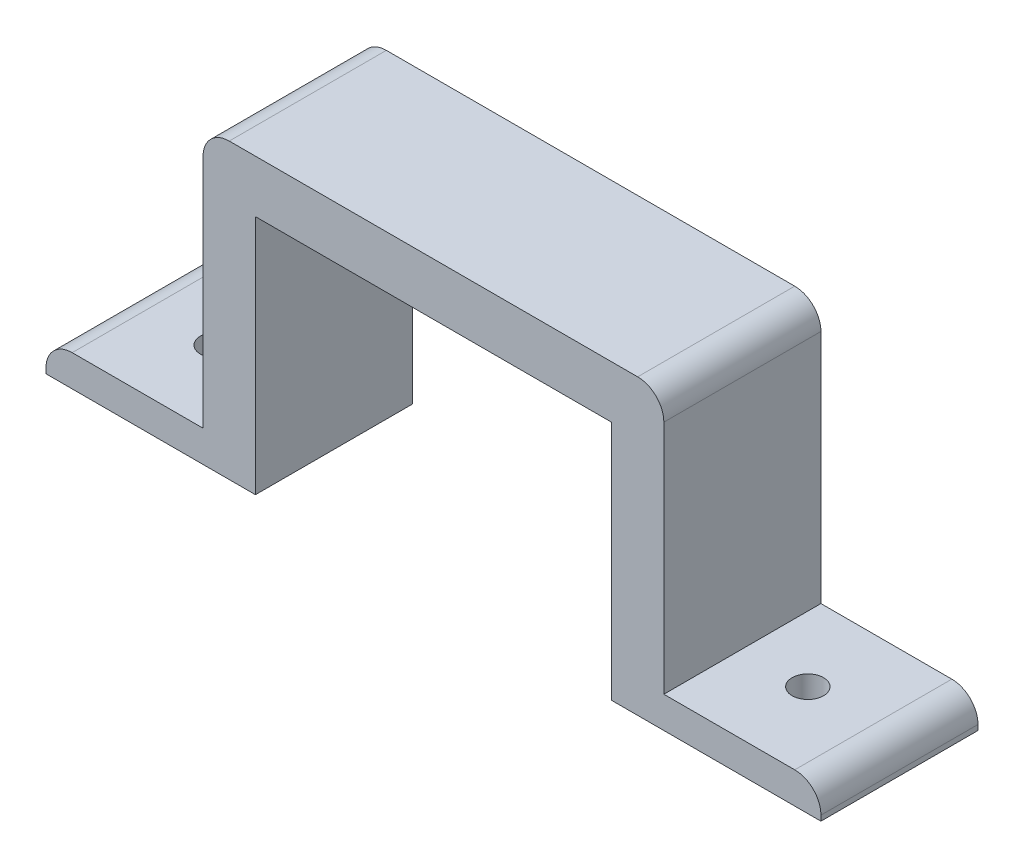
ISO-10303-21;
HEADER;
FILE_DESCRIPTION(('STEP AP214'),'2;1');
FILE_NAME('part.step','',(''),(''),'','','');
FILE_SCHEMA(('AUTOMOTIVE_DESIGN { 1 0 10303 214 1 1 1 1 }'));
ENDSEC;
DATA;
#1=APPLICATION_CONTEXT('core data for automotive mechanical design processes');
#2=APPLICATION_PROTOCOL_DEFINITION('international standard','automotive_design',2000,#1);
#3=PRODUCT_CONTEXT('',#1,'mechanical');
#4=PRODUCT('Part','Part','',(#3));
#5=PRODUCT_RELATED_PRODUCT_CATEGORY('part','',(#4));
#6=PRODUCT_DEFINITION_FORMATION('','',#4);
#7=PRODUCT_DEFINITION_CONTEXT('part definition',#1,'design');
#8=PRODUCT_DEFINITION('design','',#6,#7);
#9=PRODUCT_DEFINITION_SHAPE('','',#8);
#10=(LENGTH_UNIT() NAMED_UNIT(*) SI_UNIT(.MILLI.,.METRE.));
#11=(NAMED_UNIT(*) PLANE_ANGLE_UNIT() SI_UNIT($,.RADIAN.));
#12=(NAMED_UNIT(*) SI_UNIT($,.STERADIAN.) SOLID_ANGLE_UNIT());
#13=UNCERTAINTY_MEASURE_WITH_UNIT(LENGTH_MEASURE(1.E-05),#10,'distance_accuracy_value','');
#14=(GEOMETRIC_REPRESENTATION_CONTEXT(3) GLOBAL_UNCERTAINTY_ASSIGNED_CONTEXT((#13)) GLOBAL_UNIT_ASSIGNED_CONTEXT((#10,
#11,#12)) REPRESENTATION_CONTEXT('',''));
#15=CARTESIAN_POINT('',(0.,0.,0.));
#16=DIRECTION('',(0.,0.,1.));
#17=DIRECTION('',(1.,0.,0.));
#18=AXIS2_PLACEMENT_3D('',#15,#16,#17);
#19=CARTESIAN_POINT('',(-17.,0.,15.));
#20=DIRECTION('',(0.,1.,0.));
#21=DIRECTION('',(-1.,0.,0.));
#22=AXIS2_PLACEMENT_3D('',#19,#20,#21);
#23=PLANE('',#22);
#24=CARTESIAN_POINT('',(-28.25,0.,7.5));
#25=DIRECTION('',(0.,1.,0.));
#26=DIRECTION('',(-1.,0.,0.));
#27=AXIS2_PLACEMENT_3D('',#24,#25,#26);
#28=CIRCLE('',#27,1.5);
#29=CARTESIAN_POINT('',(-28.25,0.,9.));
#30=VERTEX_POINT('',#29);
#31=EDGE_CURVE('E270',#30,#30,#28,.F.);
#32=ORIENTED_EDGE('',*,*,#31,.F.);
#33=EDGE_LOOP('',(#32));
#34=FACE_BOUND('',#33,.T.);
#35=DIRECTION('',(1.,0.,0.));
#36=VECTOR('',#35,1.);
#37=CARTESIAN_POINT('',(-17.,0.,0.));
#38=LINE('',#37,#36);
#39=CARTESIAN_POINT('',(-37.,0.,0.));
#40=VERTEX_POINT('',#39);
#41=CARTESIAN_POINT('',(-17.,0.,0.));
#42=VERTEX_POINT('',#41);
#43=EDGE_CURVE('E170',#40,#42,#38,.T.);
#44=ORIENTED_EDGE('',*,*,#43,.T.);
#45=DIRECTION('',(0.,0.,-1.));
#46=VECTOR('',#45,1.);
#47=CARTESIAN_POINT('',(-17.,0.,15.));
#48=LINE('',#47,#46);
#49=CARTESIAN_POINT('',(-17.,0.,15.));
#50=VERTEX_POINT('',#49);
#51=EDGE_CURVE('E151',#50,#42,#48,.T.);
#52=ORIENTED_EDGE('',*,*,#51,.F.);
#53=DIRECTION('',(1.,0.,0.));
#54=VECTOR('',#53,1.);
#55=CARTESIAN_POINT('',(-17.,0.,15.));
#56=LINE('',#55,#54);
#57=CARTESIAN_POINT('',(-37.,0.,15.));
#58=VERTEX_POINT('',#57);
#59=EDGE_CURVE('E157',#58,#50,#56,.T.);
#60=ORIENTED_EDGE('',*,*,#59,.F.);
#61=DIRECTION('',(0.,0.,-1.));
#62=VECTOR('',#61,1.);
#63=CARTESIAN_POINT('',(-37.,0.,15.));
#64=LINE('',#63,#62);
#65=EDGE_CURVE('E239',#58,#40,#64,.T.);
#66=ORIENTED_EDGE('',*,*,#65,.T.);
#67=EDGE_LOOP('',(#44,#52,#60,#66));
#68=FACE_BOUND('',#67,.T.);
#69=ADVANCED_FACE('F33',(#34,#68),#23,.F.);
#70=CARTESIAN_POINT('',(-17.,23.,15.));
#71=DIRECTION('',(-1.,0.,0.));
#72=DIRECTION('',(0.,-1.,0.));
#73=AXIS2_PLACEMENT_3D('',#70,#71,#72);
#74=PLANE('',#73);
#75=DIRECTION('',(0.,1.,0.));
#76=VECTOR('',#75,1.);
#77=CARTESIAN_POINT('',(-17.,23.,0.));
#78=LINE('',#77,#76);
#79=CARTESIAN_POINT('',(-17.,23.,0.));
#80=VERTEX_POINT('',#79);
#81=EDGE_CURVE('E265',#42,#80,#78,.T.);
#82=ORIENTED_EDGE('',*,*,#81,.T.);
#83=DIRECTION('',(0.,0.,-1.));
#84=VECTOR('',#83,1.);
#85=CARTESIAN_POINT('',(-17.,23.,15.));
#86=LINE('',#85,#84);
#87=CARTESIAN_POINT('',(-17.,23.,15.));
#88=VERTEX_POINT('',#87);
#89=EDGE_CURVE('E154',#88,#80,#86,.T.);
#90=ORIENTED_EDGE('',*,*,#89,.F.);
#91=DIRECTION('',(0.,1.,0.));
#92=VECTOR('',#91,1.);
#93=CARTESIAN_POINT('',(-17.,23.,15.));
#94=LINE('',#93,#92);
#95=EDGE_CURVE('E147',#50,#88,#94,.T.);
#96=ORIENTED_EDGE('',*,*,#95,.F.);
#97=ORIENTED_EDGE('',*,*,#51,.T.);
#98=EDGE_LOOP('',(#82,#90,#96,#97));
#99=FACE_BOUND('',#98,.T.);
#100=ADVANCED_FACE('F149',(#99),#74,.F.);
#101=CARTESIAN_POINT('',(17.,23.,15.));
#102=DIRECTION('',(0.,1.,0.));
#103=DIRECTION('',(0.,0.,1.));
#104=AXIS2_PLACEMENT_3D('',#101,#102,#103);
#105=PLANE('',#104);
#106=DIRECTION('',(1.,0.,0.));
#107=VECTOR('',#106,1.);
#108=CARTESIAN_POINT('',(17.,23.,0.));
#109=LINE('',#108,#107);
#110=CARTESIAN_POINT('',(17.,23.,0.));
#111=VERTEX_POINT('',#110);
#112=EDGE_CURVE('E263',#80,#111,#109,.T.);
#113=ORIENTED_EDGE('',*,*,#112,.T.);
#114=DIRECTION('',(0.,0.,-1.));
#115=VECTOR('',#114,1.);
#116=CARTESIAN_POINT('',(17.,23.,15.));
#117=LINE('',#116,#115);
#118=CARTESIAN_POINT('',(17.,23.,15.));
#119=VERTEX_POINT('',#118);
#120=EDGE_CURVE('E176',#119,#111,#117,.T.);
#121=ORIENTED_EDGE('',*,*,#120,.F.);
#122=DIRECTION('',(1.,0.,0.));
#123=VECTOR('',#122,1.);
#124=CARTESIAN_POINT('',(17.,23.,15.));
#125=LINE('',#124,#123);
#126=EDGE_CURVE('E156',#88,#119,#125,.T.);
#127=ORIENTED_EDGE('',*,*,#126,.F.);
#128=ORIENTED_EDGE('',*,*,#89,.T.);
#129=EDGE_LOOP('',(#113,#121,#127,#128));
#130=FACE_BOUND('',#129,.T.);
#131=ADVANCED_FACE('F319',(#130),#105,.F.);
#132=CARTESIAN_POINT('',(17.,23.,15.));
#133=DIRECTION('',(1.,0.,0.));
#134=DIRECTION('',(0.,1.,0.));
#135=AXIS2_PLACEMENT_3D('',#132,#133,#134);
#136=PLANE('',#135);
#137=DIRECTION('',(0.,-1.,0.));
#138=VECTOR('',#137,1.);
#139=CARTESIAN_POINT('',(17.,23.,0.));
#140=LINE('',#139,#138);
#141=CARTESIAN_POINT('',(17.,0.,0.));
#142=VERTEX_POINT('',#141);
#143=EDGE_CURVE('E258',#111,#142,#140,.T.);
#144=ORIENTED_EDGE('',*,*,#143,.T.);
#145=DIRECTION('',(0.,0.,-1.));
#146=VECTOR('',#145,1.);
#147=CARTESIAN_POINT('',(17.,0.,15.));
#148=LINE('',#147,#146);
#149=CARTESIAN_POINT('',(17.,0.,15.));
#150=VERTEX_POINT('',#149);
#151=EDGE_CURVE('E249',#150,#142,#148,.T.);
#152=ORIENTED_EDGE('',*,*,#151,.F.);
#153=DIRECTION('',(0.,-1.,0.));
#154=VECTOR('',#153,1.);
#155=CARTESIAN_POINT('',(17.,23.,15.));
#156=LINE('',#155,#154);
#157=EDGE_CURVE('E259',#119,#150,#156,.T.);
#158=ORIENTED_EDGE('',*,*,#157,.F.);
#159=ORIENTED_EDGE('',*,*,#120,.T.);
#160=EDGE_LOOP('',(#144,#152,#158,#159));
#161=FACE_BOUND('',#160,.T.);
#162=ADVANCED_FACE('F256',(#161),#136,.F.);
#163=CARTESIAN_POINT('',(17.,0.,15.));
#164=DIRECTION('',(0.,1.,0.));
#165=DIRECTION('',(-1.,0.,0.));
#166=AXIS2_PLACEMENT_3D('',#163,#164,#165);
#167=PLANE('',#166);
#168=CARTESIAN_POINT('',(28.25,0.,7.49999999999999));
#169=DIRECTION('',(0.,1.,0.));
#170=DIRECTION('',(-1.,0.,0.));
#171=AXIS2_PLACEMENT_3D('',#168,#169,#170);
#172=CIRCLE('',#171,1.5);
#173=CARTESIAN_POINT('',(28.25,0.,8.99999999999999));
#174=VERTEX_POINT('',#173);
#175=EDGE_CURVE('E289',#174,#174,#172,.F.);
#176=ORIENTED_EDGE('',*,*,#175,.F.);
#177=EDGE_LOOP('',(#176));
#178=FACE_BOUND('',#177,.T.);
#179=DIRECTION('',(1.,0.,0.));
#180=VECTOR('',#179,1.);
#181=CARTESIAN_POINT('',(17.,0.,0.));
#182=LINE('',#181,#180);
#183=CARTESIAN_POINT('',(37.,0.,0.));
#184=VERTEX_POINT('',#183);
#185=EDGE_CURVE('E228',#142,#184,#182,.T.);
#186=ORIENTED_EDGE('',*,*,#185,.T.);
#187=DIRECTION('',(0.,0.,-1.));
#188=VECTOR('',#187,1.);
#189=CARTESIAN_POINT('',(37.,0.,15.));
#190=LINE('',#189,#188);
#191=CARTESIAN_POINT('',(37.,0.,15.));
#192=VERTEX_POINT('',#191);
#193=EDGE_CURVE('E246',#192,#184,#190,.T.);
#194=ORIENTED_EDGE('',*,*,#193,.F.);
#195=DIRECTION('',(1.,0.,0.));
#196=VECTOR('',#195,1.);
#197=CARTESIAN_POINT('',(17.,0.,15.));
#198=LINE('',#197,#196);
#199=EDGE_CURVE('E285',#150,#192,#198,.T.);
#200=ORIENTED_EDGE('',*,*,#199,.F.);
#201=ORIENTED_EDGE('',*,*,#151,.T.);
#202=EDGE_LOOP('',(#186,#194,#200,#201));
#203=FACE_BOUND('',#202,.T.);
#204=ADVANCED_FACE('F323',(#178,#203),#167,.F.);
#205=CARTESIAN_POINT('',(37.,0.,15.));
#206=DIRECTION('',(-1.,0.,0.));
#207=DIRECTION('',(0.,0.,1.));
#208=AXIS2_PLACEMENT_3D('',#205,#206,#207);
#209=PLANE('',#208);
#210=DIRECTION('',(0.,1.,0.));
#211=VECTOR('',#210,1.);
#212=CARTESIAN_POINT('',(37.,0.,0.));
#213=LINE('',#212,#211);
#214=CARTESIAN_POINT('',(37.,0.5,0.));
#215=VERTEX_POINT('',#214);
#216=EDGE_CURVE('E224',#184,#215,#213,.T.);
#217=ORIENTED_EDGE('',*,*,#216,.T.);
#218=DIRECTION('',(0.,0.,-1.));
#219=VECTOR('',#218,1.);
#220=CARTESIAN_POINT('',(37.,0.5,15.));
#221=LINE('',#220,#219);
#222=CARTESIAN_POINT('',(37.,0.5,15.));
#223=VERTEX_POINT('',#222);
#224=EDGE_CURVE('E11',#215,#223,#221,.F.);
#225=ORIENTED_EDGE('',*,*,#224,.T.);
#226=DIRECTION('',(0.,1.,0.));
#227=VECTOR('',#226,1.);
#228=CARTESIAN_POINT('',(37.,0.,15.));
#229=LINE('',#228,#227);
#230=EDGE_CURVE('E282',#192,#223,#229,.T.);
#231=ORIENTED_EDGE('',*,*,#230,.F.);
#232=ORIENTED_EDGE('',*,*,#193,.T.);
#233=EDGE_LOOP('',(#217,#225,#231,#232));
#234=FACE_BOUND('',#233,.T.);
#235=ADVANCED_FACE('F326',(#234),#209,.F.);
#236=CARTESIAN_POINT('',(37.,3.,15.));
#237=DIRECTION('',(0.,-1.,0.));
#238=DIRECTION('',(0.,0.,-1.));
#239=AXIS2_PLACEMENT_3D('',#236,#237,#238);
#240=PLANE('',#239);
#241=CARTESIAN_POINT('',(28.25,3.,7.49999999999999));
#242=DIRECTION('',(0.,1.,0.));
#243=DIRECTION('',(0.,0.,-1.));
#244=AXIS2_PLACEMENT_3D('',#241,#242,#243);
#245=CIRCLE('',#244,1.5);
#246=CARTESIAN_POINT('',(28.25,3.,8.99999999999999));
#247=VERTEX_POINT('',#246);
#248=EDGE_CURVE('E293',#247,#247,#245,.T.);
#249=ORIENTED_EDGE('',*,*,#248,.F.);
#250=EDGE_LOOP('',(#249));
#251=FACE_BOUND('',#250,.T.);
#252=DIRECTION('',(-1.,0.,0.));
#253=VECTOR('',#252,1.);
#254=CARTESIAN_POINT('',(37.,3.,15.));
#255=LINE('',#254,#253);
#256=CARTESIAN_POINT('',(34.5,3.,15.));
#257=VERTEX_POINT('',#256);
#258=CARTESIAN_POINT('',(22.,3.,15.));
#259=VERTEX_POINT('',#258);
#260=EDGE_CURVE('E213',#257,#259,#255,.T.);
#261=ORIENTED_EDGE('',*,*,#260,.F.);
#262=DIRECTION('',(0.,0.,-1.));
#263=VECTOR('',#262,1.);
#264=CARTESIAN_POINT('',(34.5,3.,15.));
#265=LINE('',#264,#263);
#266=CARTESIAN_POINT('',(34.5,3.,0.));
#267=VERTEX_POINT('',#266);
#268=EDGE_CURVE('E41',#257,#267,#265,.T.);
#269=ORIENTED_EDGE('',*,*,#268,.T.);
#270=DIRECTION('',(-1.,0.,0.));
#271=VECTOR('',#270,1.);
#272=CARTESIAN_POINT('',(37.,3.,0.));
#273=LINE('',#272,#271);
#274=CARTESIAN_POINT('',(22.,3.,0.));
#275=VERTEX_POINT('',#274);
#276=EDGE_CURVE('E211',#267,#275,#273,.T.);
#277=ORIENTED_EDGE('',*,*,#276,.T.);
#278=DIRECTION('',(0.,0.,-1.));
#279=VECTOR('',#278,1.);
#280=CARTESIAN_POINT('',(22.,3.,15.));
#281=LINE('',#280,#279);
#282=EDGE_CURVE('E244',#259,#275,#281,.T.);
#283=ORIENTED_EDGE('',*,*,#282,.F.);
#284=EDGE_LOOP('',(#261,#269,#277,#283));
#285=FACE_BOUND('',#284,.T.);
#286=ADVANCED_FACE('F209',(#251,#285),#240,.F.);
#287=CARTESIAN_POINT('',(22.,3.,15.));
#288=DIRECTION('',(-1.,0.,0.));
#289=DIRECTION('',(0.,0.,1.));
#290=AXIS2_PLACEMENT_3D('',#287,#288,#289);
#291=PLANE('',#290);
#292=DIRECTION('',(0.,1.,0.));
#293=VECTOR('',#292,1.);
#294=CARTESIAN_POINT('',(22.,3.,0.));
#295=LINE('',#294,#293);
#296=CARTESIAN_POINT('',(22.,25.5,0.));
#297=VERTEX_POINT('',#296);
#298=EDGE_CURVE('E223',#275,#297,#295,.T.);
#299=ORIENTED_EDGE('',*,*,#298,.T.);
#300=DIRECTION('',(0.,0.,-1.));
#301=VECTOR('',#300,1.);
#302=CARTESIAN_POINT('',(22.,25.5,15.));
#303=LINE('',#302,#301);
#304=CARTESIAN_POINT('',(22.,25.5,15.));
#305=VERTEX_POINT('',#304);
#306=EDGE_CURVE('E203',#297,#305,#303,.F.);
#307=ORIENTED_EDGE('',*,*,#306,.T.);
#308=DIRECTION('',(0.,1.,0.));
#309=VECTOR('',#308,1.);
#310=CARTESIAN_POINT('',(22.,3.,15.));
#311=LINE('',#310,#309);
#312=EDGE_CURVE('E278',#259,#305,#311,.T.);
#313=ORIENTED_EDGE('',*,*,#312,.F.);
#314=ORIENTED_EDGE('',*,*,#282,.T.);
#315=EDGE_LOOP('',(#299,#307,#313,#314));
#316=FACE_BOUND('',#315,.T.);
#317=ADVANCED_FACE('F363',(#316),#291,.F.);
#318=CARTESIAN_POINT('',(-22.,28.,15.));
#319=DIRECTION('',(0.,-1.,0.));
#320=DIRECTION('',(0.,0.,-1.));
#321=AXIS2_PLACEMENT_3D('',#318,#319,#320);
#322=PLANE('',#321);
#323=DIRECTION('',(-1.,0.,0.));
#324=VECTOR('',#323,1.);
#325=CARTESIAN_POINT('',(-22.,28.,0.));
#326=LINE('',#325,#324);
#327=CARTESIAN_POINT('',(19.5,28.,0.));
#328=VERTEX_POINT('',#327);
#329=CARTESIAN_POINT('',(-19.5,28.,0.));
#330=VERTEX_POINT('',#329);
#331=EDGE_CURVE('E226',#328,#330,#326,.T.);
#332=ORIENTED_EDGE('',*,*,#331,.T.);
#333=DIRECTION('',(0.,0.,-1.));
#334=VECTOR('',#333,1.);
#335=CARTESIAN_POINT('',(-19.5,28.,15.));
#336=LINE('',#335,#334);
#337=CARTESIAN_POINT('',(-19.5,28.,15.));
#338=VERTEX_POINT('',#337);
#339=EDGE_CURVE('E56',#330,#338,#336,.F.);
#340=ORIENTED_EDGE('',*,*,#339,.T.);
#341=DIRECTION('',(-1.,0.,0.));
#342=VECTOR('',#341,1.);
#343=CARTESIAN_POINT('',(-22.,28.,15.));
#344=LINE('',#343,#342);
#345=CARTESIAN_POINT('',(19.5,28.,15.));
#346=VERTEX_POINT('',#345);
#347=EDGE_CURVE('E276',#346,#338,#344,.T.);
#348=ORIENTED_EDGE('',*,*,#347,.F.);
#349=DIRECTION('',(0.,0.,-1.));
#350=VECTOR('',#349,1.);
#351=CARTESIAN_POINT('',(19.5,28.,15.));
#352=LINE('',#351,#350);
#353=EDGE_CURVE('E199',#346,#328,#352,.T.);
#354=ORIENTED_EDGE('',*,*,#353,.T.);
#355=EDGE_LOOP('',(#332,#340,#348,#354));
#356=FACE_BOUND('',#355,.T.);
#357=ADVANCED_FACE('F358',(#356),#322,.F.);
#358=CARTESIAN_POINT('',(-22.,3.,15.));
#359=DIRECTION('',(1.,0.,0.));
#360=DIRECTION('',(0.,0.,-1.));
#361=AXIS2_PLACEMENT_3D('',#358,#359,#360);
#362=PLANE('',#361);
#363=DIRECTION('',(0.,-1.,0.));
#364=VECTOR('',#363,1.);
#365=CARTESIAN_POINT('',(-22.,3.,15.));
#366=LINE('',#365,#364);
#367=CARTESIAN_POINT('',(-22.,25.5,15.));
#368=VERTEX_POINT('',#367);
#369=CARTESIAN_POINT('',(-22.,3.,15.));
#370=VERTEX_POINT('',#369);
#371=EDGE_CURVE('E274',#368,#370,#366,.T.);
#372=ORIENTED_EDGE('',*,*,#371,.F.);
#373=DIRECTION('',(0.,0.,-1.));
#374=VECTOR('',#373,1.);
#375=CARTESIAN_POINT('',(-22.,25.5,15.));
#376=LINE('',#375,#374);
#377=CARTESIAN_POINT('',(-22.,25.5,0.));
#378=VERTEX_POINT('',#377);
#379=EDGE_CURVE('E196',#368,#378,#376,.T.);
#380=ORIENTED_EDGE('',*,*,#379,.T.);
#381=DIRECTION('',(0.,-1.,0.));
#382=VECTOR('',#381,1.);
#383=CARTESIAN_POINT('',(-22.,3.,0.));
#384=LINE('',#383,#382);
#385=CARTESIAN_POINT('',(-22.,3.,0.));
#386=VERTEX_POINT('',#385);
#387=EDGE_CURVE('E233',#378,#386,#384,.T.);
#388=ORIENTED_EDGE('',*,*,#387,.T.);
#389=DIRECTION('',(0.,0.,-1.));
#390=VECTOR('',#389,1.);
#391=CARTESIAN_POINT('',(-22.,3.,15.));
#392=LINE('',#391,#390);
#393=EDGE_CURVE('E241',#370,#386,#392,.T.);
#394=ORIENTED_EDGE('',*,*,#393,.F.);
#395=EDGE_LOOP('',(#372,#380,#388,#394));
#396=FACE_BOUND('',#395,.T.);
#397=ADVANCED_FACE('F307',(#396),#362,.F.);
#398=CARTESIAN_POINT('',(-37.,3.,15.));
#399=DIRECTION('',(0.,-1.,0.));
#400=DIRECTION('',(0.,0.,-1.));
#401=AXIS2_PLACEMENT_3D('',#398,#399,#400);
#402=PLANE('',#401);
#403=CARTESIAN_POINT('',(-28.25,3.,7.5));
#404=DIRECTION('',(0.,1.,0.));
#405=DIRECTION('',(0.,0.,1.));
#406=AXIS2_PLACEMENT_3D('',#403,#404,#405);
#407=CIRCLE('',#406,1.5);
#408=CARTESIAN_POINT('',(-28.25,3.,9.));
#409=VERTEX_POINT('',#408);
#410=EDGE_CURVE('E292',#409,#409,#407,.T.);
#411=ORIENTED_EDGE('',*,*,#410,.F.);
#412=EDGE_LOOP('',(#411));
#413=FACE_BOUND('',#412,.T.);
#414=DIRECTION('',(-1.,0.,0.));
#415=VECTOR('',#414,1.);
#416=CARTESIAN_POINT('',(-37.,3.,0.));
#417=LINE('',#416,#415);
#418=CARTESIAN_POINT('',(-34.5,3.,0.));
#419=VERTEX_POINT('',#418);
#420=EDGE_CURVE('E235',#386,#419,#417,.T.);
#421=ORIENTED_EDGE('',*,*,#420,.T.);
#422=DIRECTION('',(0.,0.,-1.));
#423=VECTOR('',#422,1.);
#424=CARTESIAN_POINT('',(-34.5,3.,15.));
#425=LINE('',#424,#423);
#426=CARTESIAN_POINT('',(-34.5,3.,15.));
#427=VERTEX_POINT('',#426);
#428=EDGE_CURVE('E187',#419,#427,#425,.F.);
#429=ORIENTED_EDGE('',*,*,#428,.T.);
#430=DIRECTION('',(-1.,0.,0.));
#431=VECTOR('',#430,1.);
#432=CARTESIAN_POINT('',(-37.,3.,15.));
#433=LINE('',#432,#431);
#434=EDGE_CURVE('E272',#370,#427,#433,.T.);
#435=ORIENTED_EDGE('',*,*,#434,.F.);
#436=ORIENTED_EDGE('',*,*,#393,.T.);
#437=EDGE_LOOP('',(#421,#429,#435,#436));
#438=FACE_BOUND('',#437,.T.);
#439=ADVANCED_FACE('F303',(#413,#438),#402,.F.);
#440=CARTESIAN_POINT('',(-37.,0.,15.));
#441=DIRECTION('',(1.,0.,0.));
#442=DIRECTION('',(0.,0.,-1.));
#443=AXIS2_PLACEMENT_3D('',#440,#441,#442);
#444=PLANE('',#443);
#445=DIRECTION('',(0.,-1.,0.));
#446=VECTOR('',#445,1.);
#447=CARTESIAN_POINT('',(-37.,0.,15.));
#448=LINE('',#447,#446);
#449=CARTESIAN_POINT('',(-37.,0.5,15.));
#450=VERTEX_POINT('',#449);
#451=EDGE_CURVE('E163',#450,#58,#448,.T.);
#452=ORIENTED_EDGE('',*,*,#451,.F.);
#453=DIRECTION('',(0.,0.,-1.));
#454=VECTOR('',#453,1.);
#455=CARTESIAN_POINT('',(-37.,0.5,15.));
#456=LINE('',#455,#454);
#457=CARTESIAN_POINT('',(-37.,0.5,0.));
#458=VERTEX_POINT('',#457);
#459=EDGE_CURVE('E171',#450,#458,#456,.T.);
#460=ORIENTED_EDGE('',*,*,#459,.T.);
#461=DIRECTION('',(0.,-1.,0.));
#462=VECTOR('',#461,1.);
#463=CARTESIAN_POINT('',(-37.,0.,0.));
#464=LINE('',#463,#462);
#465=EDGE_CURVE('E167',#458,#40,#464,.T.);
#466=ORIENTED_EDGE('',*,*,#465,.T.);
#467=ORIENTED_EDGE('',*,*,#65,.F.);
#468=EDGE_LOOP('',(#452,#460,#466,#467));
#469=FACE_BOUND('',#468,.T.);
#470=ADVANCED_FACE('F306',(#469),#444,.F.);
#471=CARTESIAN_POINT('',(0.,0.,15.));
#472=DIRECTION('',(0.,0.,-1.));
#473=DIRECTION('',(-1.,0.,0.));
#474=AXIS2_PLACEMENT_3D('',#471,#472,#473);
#475=PLANE('',#474);
#476=ORIENTED_EDGE('',*,*,#434,.T.);
#477=CARTESIAN_POINT('',(-34.5,0.5,15.));
#478=DIRECTION('',(0.,0.,-1.));
#479=DIRECTION('',(-1.,0.,0.));
#480=AXIS2_PLACEMENT_3D('',#477,#478,#479);
#481=CIRCLE('',#480,2.5);
#482=EDGE_CURVE('E194',#427,#450,#481,.F.);
#483=ORIENTED_EDGE('',*,*,#482,.T.);
#484=ORIENTED_EDGE('',*,*,#451,.T.);
#485=ORIENTED_EDGE('',*,*,#59,.T.);
#486=ORIENTED_EDGE('',*,*,#95,.T.);
#487=ORIENTED_EDGE('',*,*,#126,.T.);
#488=ORIENTED_EDGE('',*,*,#157,.T.);
#489=ORIENTED_EDGE('',*,*,#199,.T.);
#490=ORIENTED_EDGE('',*,*,#230,.T.);
#491=CARTESIAN_POINT('',(34.5,0.5,15.));
#492=DIRECTION('',(0.,0.,-1.));
#493=DIRECTION('',(-1.,0.,0.));
#494=AXIS2_PLACEMENT_3D('',#491,#492,#493);
#495=CIRCLE('',#494,2.5);
#496=EDGE_CURVE('E189',#223,#257,#495,.F.);
#497=ORIENTED_EDGE('',*,*,#496,.T.);
#498=ORIENTED_EDGE('',*,*,#260,.T.);
#499=ORIENTED_EDGE('',*,*,#312,.T.);
#500=CARTESIAN_POINT('',(19.5,25.5,15.));
#501=DIRECTION('',(0.,0.,-1.));
#502=DIRECTION('',(-1.,0.,0.));
#503=AXIS2_PLACEMENT_3D('',#500,#501,#502);
#504=CIRCLE('',#503,2.5);
#505=EDGE_CURVE('E191',#305,#346,#504,.F.);
#506=ORIENTED_EDGE('',*,*,#505,.T.);
#507=ORIENTED_EDGE('',*,*,#347,.T.);
#508=CARTESIAN_POINT('',(-19.5,25.5,15.));
#509=DIRECTION('',(0.,0.,-1.));
#510=DIRECTION('',(-1.,0.,0.));
#511=AXIS2_PLACEMENT_3D('',#508,#509,#510);
#512=CIRCLE('',#511,2.5);
#513=EDGE_CURVE('E48',#338,#368,#512,.F.);
#514=ORIENTED_EDGE('',*,*,#513,.T.);
#515=ORIENTED_EDGE('',*,*,#371,.T.);
#516=EDGE_LOOP('',(#476,#483,#484,#485,#486,#487,#488,#489,#490,#497,#498,#499,#506,#507,#514,#515));
#517=FACE_BOUND('',#516,.T.);
#518=ADVANCED_FACE('F161',(#517),#475,.F.);
#519=CARTESIAN_POINT('',(0.,0.,0.));
#520=DIRECTION('',(0.,0.,-1.));
#521=DIRECTION('',(-1.,0.,0.));
#522=AXIS2_PLACEMENT_3D('',#519,#520,#521);
#523=PLANE('',#522);
#524=ORIENTED_EDGE('',*,*,#465,.F.);
#525=CARTESIAN_POINT('',(-34.5,0.5,0.));
#526=DIRECTION('',(0.,0.,-1.));
#527=DIRECTION('',(-1.,0.,0.));
#528=AXIS2_PLACEMENT_3D('',#525,#526,#527);
#529=CIRCLE('',#528,2.5);
#530=EDGE_CURVE('E185',#458,#419,#529,.T.);
#531=ORIENTED_EDGE('',*,*,#530,.T.);
#532=ORIENTED_EDGE('',*,*,#420,.F.);
#533=ORIENTED_EDGE('',*,*,#387,.F.);
#534=CARTESIAN_POINT('',(-19.5,25.5,0.));
#535=DIRECTION('',(0.,0.,-1.));
#536=DIRECTION('',(-1.,0.,0.));
#537=AXIS2_PLACEMENT_3D('',#534,#535,#536);
#538=CIRCLE('',#537,2.5);
#539=EDGE_CURVE('E183',#378,#330,#538,.T.);
#540=ORIENTED_EDGE('',*,*,#539,.T.);
#541=ORIENTED_EDGE('',*,*,#331,.F.);
#542=CARTESIAN_POINT('',(19.5,25.5,0.));
#543=DIRECTION('',(0.,0.,-1.));
#544=DIRECTION('',(-1.,0.,0.));
#545=AXIS2_PLACEMENT_3D('',#542,#543,#544);
#546=CIRCLE('',#545,2.5);
#547=EDGE_CURVE('E181',#328,#297,#546,.T.);
#548=ORIENTED_EDGE('',*,*,#547,.T.);
#549=ORIENTED_EDGE('',*,*,#298,.F.);
#550=ORIENTED_EDGE('',*,*,#276,.F.);
#551=CARTESIAN_POINT('',(34.5,0.5,0.));
#552=DIRECTION('',(0.,0.,-1.));
#553=DIRECTION('',(-1.,0.,0.));
#554=AXIS2_PLACEMENT_3D('',#551,#552,#553);
#555=CIRCLE('',#554,2.5);
#556=EDGE_CURVE('E174',#267,#215,#555,.T.);
#557=ORIENTED_EDGE('',*,*,#556,.T.);
#558=ORIENTED_EDGE('',*,*,#216,.F.);
#559=ORIENTED_EDGE('',*,*,#185,.F.);
#560=ORIENTED_EDGE('',*,*,#143,.F.);
#561=ORIENTED_EDGE('',*,*,#112,.F.);
#562=ORIENTED_EDGE('',*,*,#81,.F.);
#563=ORIENTED_EDGE('',*,*,#43,.F.);
#564=EDGE_LOOP('',(#524,#531,#532,#533,#540,#541,#548,#549,#550,#557,#558,#559,#560,#561,#562,#563));
#565=FACE_BOUND('',#564,.T.);
#566=ADVANCED_FACE('F219',(#565),#523,.T.);
#567=CARTESIAN_POINT('',(-34.5,0.5,15.));
#568=DIRECTION('',(0.,0.,-1.));
#569=DIRECTION('',(-1.,0.,0.));
#570=AXIS2_PLACEMENT_3D('',#567,#568,#569);
#571=CYLINDRICAL_SURFACE('',#570,2.5);
#572=ORIENTED_EDGE('',*,*,#482,.F.);
#573=ORIENTED_EDGE('',*,*,#428,.F.);
#574=ORIENTED_EDGE('',*,*,#530,.F.);
#575=ORIENTED_EDGE('',*,*,#459,.F.);
#576=EDGE_LOOP('',(#572,#573,#574,#575));
#577=FACE_BOUND('',#576,.T.);
#578=ADVANCED_FACE('F316',(#577),#571,.T.);
#579=CARTESIAN_POINT('',(-19.5,25.5,15.));
#580=DIRECTION('',(0.,0.,-1.));
#581=DIRECTION('',(-1.,0.,0.));
#582=AXIS2_PLACEMENT_3D('',#579,#580,#581);
#583=CYLINDRICAL_SURFACE('',#582,2.5);
#584=ORIENTED_EDGE('',*,*,#513,.F.);
#585=ORIENTED_EDGE('',*,*,#339,.F.);
#586=ORIENTED_EDGE('',*,*,#539,.F.);
#587=ORIENTED_EDGE('',*,*,#379,.F.);
#588=EDGE_LOOP('',(#584,#585,#586,#587));
#589=FACE_BOUND('',#588,.T.);
#590=ADVANCED_FACE('F337',(#589),#583,.T.);
#591=CARTESIAN_POINT('',(19.5,25.5,15.));
#592=DIRECTION('',(0.,0.,-1.));
#593=DIRECTION('',(-1.,0.,0.));
#594=AXIS2_PLACEMENT_3D('',#591,#592,#593);
#595=CYLINDRICAL_SURFACE('',#594,2.5);
#596=ORIENTED_EDGE('',*,*,#505,.F.);
#597=ORIENTED_EDGE('',*,*,#306,.F.);
#598=ORIENTED_EDGE('',*,*,#547,.F.);
#599=ORIENTED_EDGE('',*,*,#353,.F.);
#600=EDGE_LOOP('',(#596,#597,#598,#599));
#601=FACE_BOUND('',#600,.T.);
#602=ADVANCED_FACE('F329',(#601),#595,.T.);
#603=CARTESIAN_POINT('',(34.5,0.5,15.));
#604=DIRECTION('',(0.,0.,-1.));
#605=DIRECTION('',(-1.,0.,0.));
#606=AXIS2_PLACEMENT_3D('',#603,#604,#605);
#607=CYLINDRICAL_SURFACE('',#606,2.5);
#608=ORIENTED_EDGE('',*,*,#496,.F.);
#609=ORIENTED_EDGE('',*,*,#224,.F.);
#610=ORIENTED_EDGE('',*,*,#556,.F.);
#611=ORIENTED_EDGE('',*,*,#268,.F.);
#612=EDGE_LOOP('',(#608,#609,#610,#611));
#613=FACE_BOUND('',#612,.T.);
#614=ADVANCED_FACE('F35',(#613),#607,.T.);
#615=CARTESIAN_POINT('',(-28.25,-4.24264068711929,7.5));
#616=DIRECTION('',(0.,1.,0.));
#617=DIRECTION('',(0.,0.,1.));
#618=AXIS2_PLACEMENT_3D('',#615,#616,#617);
#619=CYLINDRICAL_SURFACE('',#618,1.5);
#620=CARTESIAN_POINT('',(-28.25,0.,9.));
#621=CARTESIAN_POINT('',(-28.25,0.0312499999999983,9.));
#622=CARTESIAN_POINT('',(-28.25,0.0624999999999983,9.));
#623=CARTESIAN_POINT('',(-28.25,0.124999999999998,9.));
#624=CARTESIAN_POINT('',(-28.25,0.156249999999998,9.));
#625=CARTESIAN_POINT('',(-28.25,0.218749999999998,9.));
#626=CARTESIAN_POINT('',(-28.25,0.249999999999999,9.));
#627=CARTESIAN_POINT('',(-28.25,0.312499999999999,9.));
#628=CARTESIAN_POINT('',(-28.25,0.343749999999999,9.));
#629=CARTESIAN_POINT('',(-28.25,0.406249999999999,9.));
#630=CARTESIAN_POINT('',(-28.25,0.437499999999999,9.));
#631=CARTESIAN_POINT('',(-28.25,0.499999999999999,9.));
#632=CARTESIAN_POINT('',(-28.25,0.531249999999999,9.));
#633=CARTESIAN_POINT('',(-28.25,0.593749999999999,9.));
#634=CARTESIAN_POINT('',(-28.25,0.624999999999999,9.));
#635=CARTESIAN_POINT('',(-28.25,0.687499999999999,9.));
#636=CARTESIAN_POINT('',(-28.25,0.718749999999999,9.));
#637=CARTESIAN_POINT('',(-28.25,0.781249999999999,9.));
#638=CARTESIAN_POINT('',(-28.25,0.812499999999999,9.));
#639=CARTESIAN_POINT('',(-28.25,0.874999999999999,9.));
#640=CARTESIAN_POINT('',(-28.25,0.906249999999999,9.));
#641=CARTESIAN_POINT('',(-28.25,0.968749999999998,9.));
#642=CARTESIAN_POINT('',(-28.25,0.999999999999998,9.));
#643=CARTESIAN_POINT('',(-28.25,1.0625,9.));
#644=CARTESIAN_POINT('',(-28.25,1.09375,9.));
#645=CARTESIAN_POINT('',(-28.25,1.15625,9.));
#646=CARTESIAN_POINT('',(-28.25,1.1875,9.));
#647=CARTESIAN_POINT('',(-28.25,1.25,9.));
#648=CARTESIAN_POINT('',(-28.25,1.28125,9.));
#649=CARTESIAN_POINT('',(-28.25,1.34375,9.));
#650=CARTESIAN_POINT('',(-28.25,1.375,9.));
#651=CARTESIAN_POINT('',(-28.25,1.4375,9.));
#652=CARTESIAN_POINT('',(-28.25,1.46875,9.));
#653=CARTESIAN_POINT('',(-28.25,1.53125,9.));
#654=CARTESIAN_POINT('',(-28.25,1.5625,9.));
#655=CARTESIAN_POINT('',(-28.25,1.625,9.));
#656=CARTESIAN_POINT('',(-28.25,1.65625,9.));
#657=CARTESIAN_POINT('',(-28.25,1.71875,9.));
#658=CARTESIAN_POINT('',(-28.25,1.75,9.));
#659=CARTESIAN_POINT('',(-28.25,1.8125,9.));
#660=CARTESIAN_POINT('',(-28.25,1.84375,9.));
#661=CARTESIAN_POINT('',(-28.25,1.90625,9.));
#662=CARTESIAN_POINT('',(-28.25,1.9375,9.));
#663=CARTESIAN_POINT('',(-28.25,2.,9.));
#664=CARTESIAN_POINT('',(-28.25,2.03125,9.));
#665=CARTESIAN_POINT('',(-28.25,2.09375,9.));
#666=CARTESIAN_POINT('',(-28.25,2.125,9.));
#667=CARTESIAN_POINT('',(-28.25,2.1875,9.));
#668=CARTESIAN_POINT('',(-28.25,2.21875,9.));
#669=CARTESIAN_POINT('',(-28.25,2.28125,9.));
#670=CARTESIAN_POINT('',(-28.25,2.3125,9.));
#671=CARTESIAN_POINT('',(-28.25,2.375,9.));
#672=CARTESIAN_POINT('',(-28.25,2.40625,9.));
#673=CARTESIAN_POINT('',(-28.25,2.46875,9.));
#674=CARTESIAN_POINT('',(-28.25,2.5,9.));
#675=CARTESIAN_POINT('',(-28.25,2.5625,9.));
#676=CARTESIAN_POINT('',(-28.25,2.59375,9.));
#677=CARTESIAN_POINT('',(-28.25,2.65625,9.));
#678=CARTESIAN_POINT('',(-28.25,2.6875,9.));
#679=CARTESIAN_POINT('',(-28.25,2.75,9.));
#680=CARTESIAN_POINT('',(-28.25,2.78125,9.));
#681=CARTESIAN_POINT('',(-28.25,2.84375,9.));
#682=CARTESIAN_POINT('',(-28.25,2.875,9.));
#683=CARTESIAN_POINT('',(-28.25,2.9375,9.));
#684=CARTESIAN_POINT('',(-28.25,2.96875,9.));
#685=CARTESIAN_POINT('',(-28.25,3.,9.));
#686=B_SPLINE_CURVE_WITH_KNOTS('',3,(#620,#621,#622,#623,#624,#625,#626,#627,#628,#629,#630,
#631,#632,#633,#634,#635,#636,#637,#638,#639,#640,#641,#642,#643,#644,#645,#646,#647,#648,#649,
#650,#651,#652,#653,#654,#655,#656,#657,#658,#659,#660,#661,#662,#663,#664,#665,#666,#667,#668,
#669,#670,#671,#672,#673,#674,#675,#676,#677,#678,#679,#680,#681,#682,#683,#684,#685),
.UNSPECIFIED.,.F.,.F.,(4,2,2,2,2,2,2,2,2,2,2,2,2,2,2,2,2,2,2,2,2,2,2,2,2,2,2,2,2,2,2,2,4),(0.,
0.0937500000000001,0.1875,0.28125,0.375,0.46875,0.5625,0.656250000000001,0.750000000000001,
0.843750000000001,0.9375,1.03125,1.125,1.21875,1.3125,1.40625,1.5,1.59375,1.6875,1.78125,1.875,
1.96875,2.0625,2.15625,2.25,2.34375,2.4375,2.53125,2.625,2.71875,2.8125,2.90625,3.),.UNSPECIFIED.);
#687=EDGE_CURVE('BSEAM301',#30,#409,#686,.T.);
#688=ORIENTED_EDGE('',*,*,#31,.T.);
#689=ORIENTED_EDGE('',*,*,#410,.T.);
#690=ORIENTED_EDGE('',*,*,#687,.T.);
#691=ORIENTED_EDGE('',*,*,#687,.F.);
#692=EDGE_LOOP('',(#688,#690,#689,#691));
#693=FACE_BOUND('',#692,.T.);
#694=ADVANCED_FACE('F301',(#693),#619,.F.);
#695=CARTESIAN_POINT('',(28.25,-4.24264068711929,7.49999999999999));
#696=DIRECTION('',(0.,1.,0.));
#697=DIRECTION('',(0.,0.,1.));
#698=AXIS2_PLACEMENT_3D('',#695,#696,#697);
#699=CYLINDRICAL_SURFACE('',#698,1.5);
#700=CARTESIAN_POINT('',(28.25,0.,8.99999999999999));
#701=CARTESIAN_POINT('',(28.25,0.0312500000000052,8.99999999999999));
#702=CARTESIAN_POINT('',(28.25,0.0625000000000053,8.99999999999999));
#703=CARTESIAN_POINT('',(28.25,0.125000000000005,8.99999999999999));
#704=CARTESIAN_POINT('',(28.25,0.156250000000005,8.99999999999999));
#705=CARTESIAN_POINT('',(28.25,0.218750000000005,8.99999999999999));
#706=CARTESIAN_POINT('',(28.25,0.250000000000005,8.99999999999999));
#707=CARTESIAN_POINT('',(28.25,0.312500000000005,8.99999999999999));
#708=CARTESIAN_POINT('',(28.25,0.343750000000005,8.99999999999999));
#709=CARTESIAN_POINT('',(28.25,0.406250000000004,8.99999999999999));
#710=CARTESIAN_POINT('',(28.25,0.437500000000004,8.99999999999999));
#711=CARTESIAN_POINT('',(28.25,0.500000000000004,8.99999999999999));
#712=CARTESIAN_POINT('',(28.25,0.531250000000004,8.99999999999999));
#713=CARTESIAN_POINT('',(28.25,0.593750000000004,8.99999999999999));
#714=CARTESIAN_POINT('',(28.25,0.625000000000004,8.99999999999999));
#715=CARTESIAN_POINT('',(28.25,0.687500000000004,8.99999999999999));
#716=CARTESIAN_POINT('',(28.25,0.718750000000004,8.99999999999999));
#717=CARTESIAN_POINT('',(28.25,0.781250000000004,8.99999999999999));
#718=CARTESIAN_POINT('',(28.25,0.812500000000004,8.99999999999999));
#719=CARTESIAN_POINT('',(28.25,0.875000000000003,8.99999999999999));
#720=CARTESIAN_POINT('',(28.25,0.906250000000003,8.99999999999999));
#721=CARTESIAN_POINT('',(28.25,0.968750000000003,8.99999999999999));
#722=CARTESIAN_POINT('',(28.25,1.,8.99999999999999));
#723=CARTESIAN_POINT('',(28.25,1.0625,8.99999999999999));
#724=CARTESIAN_POINT('',(28.25,1.09375,8.99999999999999));
#725=CARTESIAN_POINT('',(28.25,1.15625,8.99999999999999));
#726=CARTESIAN_POINT('',(28.25,1.1875,8.99999999999999));
#727=CARTESIAN_POINT('',(28.25,1.25,8.99999999999999));
#728=CARTESIAN_POINT('',(28.25,1.28125,8.99999999999999));
#729=CARTESIAN_POINT('',(28.25,1.34375,8.99999999999999));
#730=CARTESIAN_POINT('',(28.25,1.375,8.99999999999999));
#731=CARTESIAN_POINT('',(28.25,1.4375,8.99999999999999));
#732=CARTESIAN_POINT('',(28.25,1.46875,8.99999999999999));
#733=CARTESIAN_POINT('',(28.25,1.53125,8.99999999999999));
#734=CARTESIAN_POINT('',(28.25,1.5625,8.99999999999999));
#735=CARTESIAN_POINT('',(28.25,1.625,8.99999999999999));
#736=CARTESIAN_POINT('',(28.25,1.65625,8.99999999999999));
#737=CARTESIAN_POINT('',(28.25,1.71875,8.99999999999999));
#738=CARTESIAN_POINT('',(28.25,1.75,8.99999999999999));
#739=CARTESIAN_POINT('',(28.25,1.8125,8.99999999999999));
#740=CARTESIAN_POINT('',(28.25,1.84375,8.99999999999999));
#741=CARTESIAN_POINT('',(28.25,1.90625,8.99999999999999));
#742=CARTESIAN_POINT('',(28.25,1.9375,8.99999999999999));
#743=CARTESIAN_POINT('',(28.25,2.,8.99999999999999));
#744=CARTESIAN_POINT('',(28.25,2.03125,8.99999999999999));
#745=CARTESIAN_POINT('',(28.25,2.09375,8.99999999999999));
#746=CARTESIAN_POINT('',(28.25,2.125,8.99999999999999));
#747=CARTESIAN_POINT('',(28.25,2.1875,8.99999999999999));
#748=CARTESIAN_POINT('',(28.25,2.21875,8.99999999999999));
#749=CARTESIAN_POINT('',(28.25,2.28125,8.99999999999999));
#750=CARTESIAN_POINT('',(28.25,2.3125,8.99999999999999));
#751=CARTESIAN_POINT('',(28.25,2.375,8.99999999999999));
#752=CARTESIAN_POINT('',(28.25,2.40625,8.99999999999999));
#753=CARTESIAN_POINT('',(28.25,2.46875,8.99999999999999));
#754=CARTESIAN_POINT('',(28.25,2.5,8.99999999999999));
#755=CARTESIAN_POINT('',(28.25,2.5625,8.99999999999999));
#756=CARTESIAN_POINT('',(28.25,2.59375,8.99999999999999));
#757=CARTESIAN_POINT('',(28.25,2.65625,8.99999999999999));
#758=CARTESIAN_POINT('',(28.25,2.6875,8.99999999999999));
#759=CARTESIAN_POINT('',(28.25,2.75,8.99999999999999));
#760=CARTESIAN_POINT('',(28.25,2.78125,8.99999999999999));
#761=CARTESIAN_POINT('',(28.25,2.84375,8.99999999999999));
#762=CARTESIAN_POINT('',(28.25,2.875,8.99999999999999));
#763=CARTESIAN_POINT('',(28.25,2.9375,8.99999999999999));
#764=CARTESIAN_POINT('',(28.25,2.96875,8.99999999999999));
#765=CARTESIAN_POINT('',(28.25,3.,8.99999999999999));
#766=B_SPLINE_CURVE_WITH_KNOTS('',3,(#700,#701,#702,#703,#704,#705,#706,#707,#708,#709,#710,
#711,#712,#713,#714,#715,#716,#717,#718,#719,#720,#721,#722,#723,#724,#725,#726,#727,#728,#729,
#730,#731,#732,#733,#734,#735,#736,#737,#738,#739,#740,#741,#742,#743,#744,#745,#746,#747,#748,
#749,#750,#751,#752,#753,#754,#755,#756,#757,#758,#759,#760,#761,#762,#763,#764,#765),
.UNSPECIFIED.,.F.,.F.,(4,2,2,2,2,2,2,2,2,2,2,2,2,2,2,2,2,2,2,2,2,2,2,2,2,2,2,2,2,2,2,2,4),(0.,
0.0937500000000001,0.187499999999999,0.281249999999999,0.374999999999999,0.468749999999999,
0.562499999999999,0.656249999999999,0.749999999999999,0.843749999999998,0.937499999999998,
1.03125,1.125,1.21875,1.3125,1.40625,1.5,1.59375,1.6875,1.78125,1.875,1.96875,2.0625,2.15625,
2.25,2.34375,2.4375,2.53125,2.62499999999999,2.71874999999999,2.81249999999999,2.90624999999999,
2.99999999999999),.UNSPECIFIED.);
#767=EDGE_CURVE('BSEAM334',#174,#247,#766,.T.);
#768=ORIENTED_EDGE('',*,*,#175,.T.);
#769=ORIENTED_EDGE('',*,*,#248,.T.);
#770=ORIENTED_EDGE('',*,*,#767,.T.);
#771=ORIENTED_EDGE('',*,*,#767,.F.);
#772=EDGE_LOOP('',(#768,#770,#769,#771));
#773=FACE_BOUND('',#772,.T.);
#774=ADVANCED_FACE('F334',(#773),#699,.F.);
#775=CLOSED_SHELL('',(#69,#100,#131,#162,#204,#235,#286,#317,#357,#397,#439,#470,#518,#566,#578,
#590,#602,#614,#694,#774));
#776=MANIFOLD_SOLID_BREP('B2',#775);
#777=ADVANCED_BREP_SHAPE_REPRESENTATION('',(#18,#776),#14);
#778=SHAPE_DEFINITION_REPRESENTATION(#9,#777);
ENDSEC;
END-ISO-10303-21;
